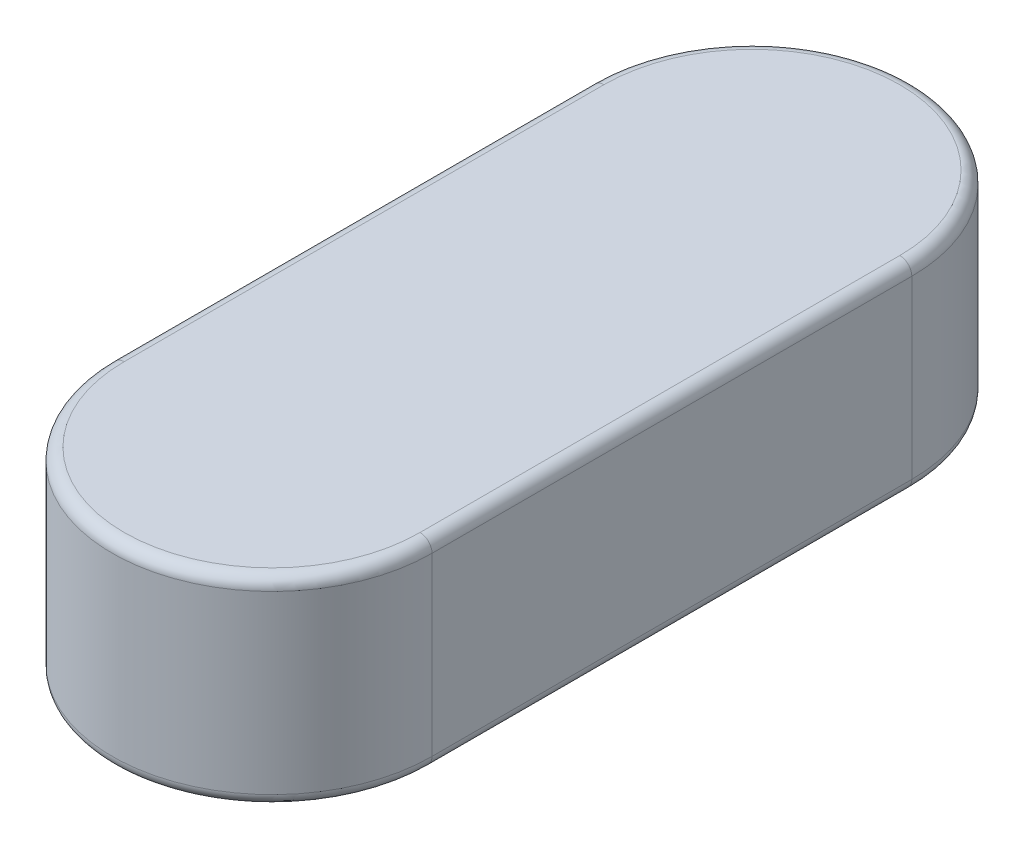
ISO-10303-21;
HEADER;
FILE_DESCRIPTION(('STEP AP214'),'2;1');
FILE_NAME('part.step','',(''),(''),'','','');
FILE_SCHEMA(('AUTOMOTIVE_DESIGN { 1 0 10303 214 1 1 1 1 }'));
ENDSEC;
DATA;
#1=APPLICATION_CONTEXT('core data for automotive mechanical design processes');
#2=APPLICATION_PROTOCOL_DEFINITION('international standard','automotive_design',2000,#1);
#3=PRODUCT_CONTEXT('',#1,'mechanical');
#4=PRODUCT('Part','Part','',(#3));
#5=PRODUCT_RELATED_PRODUCT_CATEGORY('part','',(#4));
#6=PRODUCT_DEFINITION_FORMATION('','',#4);
#7=PRODUCT_DEFINITION_CONTEXT('part definition',#1,'design');
#8=PRODUCT_DEFINITION('design','',#6,#7);
#9=PRODUCT_DEFINITION_SHAPE('','',#8);
#10=(LENGTH_UNIT() NAMED_UNIT(*) SI_UNIT(.MILLI.,.METRE.));
#11=(NAMED_UNIT(*) PLANE_ANGLE_UNIT() SI_UNIT($,.RADIAN.));
#12=(NAMED_UNIT(*) SI_UNIT($,.STERADIAN.) SOLID_ANGLE_UNIT());
#13=UNCERTAINTY_MEASURE_WITH_UNIT(LENGTH_MEASURE(1.E-05),#10,'distance_accuracy_value','');
#14=(GEOMETRIC_REPRESENTATION_CONTEXT(3) GLOBAL_UNCERTAINTY_ASSIGNED_CONTEXT((#13)) GLOBAL_UNIT_ASSIGNED_CONTEXT((#10,
#11,#12)) REPRESENTATION_CONTEXT('',''));
#15=CARTESIAN_POINT('',(0.,0.,0.));
#16=DIRECTION('',(0.,0.,1.));
#17=DIRECTION('',(1.,0.,0.));
#18=AXIS2_PLACEMENT_3D('',#15,#16,#17);
#19=CARTESIAN_POINT('',(0.,10.,0.));
#20=DIRECTION('',(0.,-1.,0.));
#21=DIRECTION('',(0.,0.,-1.));
#22=AXIS2_PLACEMENT_3D('',#19,#20,#21);
#23=CYLINDRICAL_SURFACE('',#22,8.);
#24=DIRECTION('',(0.,-1.,0.));
#25=VECTOR('',#24,1.);
#26=CARTESIAN_POINT('',(-8.,10.,0.));
#27=LINE('',#26,#25);
#28=CARTESIAN_POINT('',(-8.,9.4,0.));
#29=VERTEX_POINT('',#28);
#30=CARTESIAN_POINT('',(-8.,0.6,0.));
#31=VERTEX_POINT('',#30);
#32=EDGE_CURVE('E154',#29,#31,#27,.T.);
#33=ORIENTED_EDGE('',*,*,#32,.T.);
#34=CARTESIAN_POINT('',(0.,0.6,0.));
#35=DIRECTION('',(0.,1.,0.));
#36=DIRECTION('',(0.,0.,1.));
#37=AXIS2_PLACEMENT_3D('',#34,#35,#36);
#38=CIRCLE('',#37,8.);
#39=CARTESIAN_POINT('',(8.,0.6,0.));
#40=VERTEX_POINT('',#39);
#41=EDGE_CURVE('E163',#31,#40,#38,.T.);
#42=ORIENTED_EDGE('',*,*,#41,.T.);
#43=DIRECTION('',(0.,-1.,0.));
#44=VECTOR('',#43,1.);
#45=CARTESIAN_POINT('',(8.,10.,0.));
#46=LINE('',#45,#44);
#47=CARTESIAN_POINT('',(8.,9.4,0.));
#48=VERTEX_POINT('',#47);
#49=EDGE_CURVE('E132',#48,#40,#46,.T.);
#50=ORIENTED_EDGE('',*,*,#49,.F.);
#51=CARTESIAN_POINT('',(0.,9.4,0.));
#52=DIRECTION('',(0.,1.,0.));
#53=DIRECTION('',(0.,0.,1.));
#54=AXIS2_PLACEMENT_3D('',#51,#52,#53);
#55=CIRCLE('',#54,8.);
#56=EDGE_CURVE('E165',#48,#29,#55,.F.);
#57=ORIENTED_EDGE('',*,*,#56,.T.);
#58=EDGE_LOOP('',(#33,#42,#50,#57));
#59=FACE_BOUND('',#58,.T.);
#60=ADVANCED_FACE('F45',(#59),#23,.T.);
#61=CARTESIAN_POINT('',(8.,10.,0.));
#62=DIRECTION('',(-1.,0.,0.));
#63=DIRECTION('',(0.,0.,1.));
#64=AXIS2_PLACEMENT_3D('',#61,#62,#63);
#65=PLANE('',#64);
#66=ORIENTED_EDGE('',*,*,#49,.T.);
#67=DIRECTION('',(0.,0.,-1.));
#68=VECTOR('',#67,1.);
#69=CARTESIAN_POINT('',(8.,0.6,0.));
#70=LINE('',#69,#68);
#71=CARTESIAN_POINT('',(8.,0.6,-24.));
#72=VERTEX_POINT('',#71);
#73=EDGE_CURVE('E131',#40,#72,#70,.T.);
#74=ORIENTED_EDGE('',*,*,#73,.T.);
#75=DIRECTION('',(0.,-1.,0.));
#76=VECTOR('',#75,1.);
#77=CARTESIAN_POINT('',(8.,10.,-24.));
#78=LINE('',#77,#76);
#79=CARTESIAN_POINT('',(8.,9.4,-24.));
#80=VERTEX_POINT('',#79);
#81=EDGE_CURVE('E114',#80,#72,#78,.T.);
#82=ORIENTED_EDGE('',*,*,#81,.F.);
#83=DIRECTION('',(0.,0.,-1.));
#84=VECTOR('',#83,1.);
#85=CARTESIAN_POINT('',(8.,9.4,0.));
#86=LINE('',#85,#84);
#87=EDGE_CURVE('E128',#80,#48,#86,.F.);
#88=ORIENTED_EDGE('',*,*,#87,.T.);
#89=EDGE_LOOP('',(#66,#74,#82,#88));
#90=FACE_BOUND('',#89,.T.);
#91=ADVANCED_FACE('F127',(#90),#65,.F.);
#92=CARTESIAN_POINT('',(0.,10.,-24.));
#93=DIRECTION('',(0.,-1.,0.));
#94=DIRECTION('',(0.,0.,-1.));
#95=AXIS2_PLACEMENT_3D('',#92,#93,#94);
#96=CYLINDRICAL_SURFACE('',#95,8.);
#97=ORIENTED_EDGE('',*,*,#81,.T.);
#98=CARTESIAN_POINT('',(0.,0.6,-24.));
#99=DIRECTION('',(0.,1.,0.));
#100=DIRECTION('',(0.,0.,1.));
#101=AXIS2_PLACEMENT_3D('',#98,#99,#100);
#102=CIRCLE('',#101,8.);
#103=CARTESIAN_POINT('',(-8.,0.6,-24.));
#104=VERTEX_POINT('',#103);
#105=EDGE_CURVE('E120',#72,#104,#102,.T.);
#106=ORIENTED_EDGE('',*,*,#105,.T.);
#107=DIRECTION('',(0.,-1.,0.));
#108=VECTOR('',#107,1.);
#109=CARTESIAN_POINT('',(-8.,10.,-24.));
#110=LINE('',#109,#108);
#111=CARTESIAN_POINT('',(-8.,9.4,-24.));
#112=VERTEX_POINT('',#111);
#113=EDGE_CURVE('E116',#112,#104,#110,.T.);
#114=ORIENTED_EDGE('',*,*,#113,.F.);
#115=CARTESIAN_POINT('',(0.,9.4,-24.));
#116=DIRECTION('',(0.,1.,0.));
#117=DIRECTION('',(0.,0.,1.));
#118=AXIS2_PLACEMENT_3D('',#115,#116,#117);
#119=CIRCLE('',#118,8.);
#120=EDGE_CURVE('E111',#112,#80,#119,.F.);
#121=ORIENTED_EDGE('',*,*,#120,.T.);
#122=EDGE_LOOP('',(#97,#106,#114,#121));
#123=FACE_BOUND('',#122,.T.);
#124=ADVANCED_FACE('F113',(#123),#96,.T.);
#125=CARTESIAN_POINT('',(-8.,10.,0.));
#126=DIRECTION('',(1.,0.,0.));
#127=DIRECTION('',(0.,0.,-1.));
#128=AXIS2_PLACEMENT_3D('',#125,#126,#127);
#129=PLANE('',#128);
#130=ORIENTED_EDGE('',*,*,#113,.T.);
#131=DIRECTION('',(0.,0.,1.));
#132=VECTOR('',#131,1.);
#133=CARTESIAN_POINT('',(-8.,0.6,0.));
#134=LINE('',#133,#132);
#135=EDGE_CURVE('E167',#104,#31,#134,.T.);
#136=ORIENTED_EDGE('',*,*,#135,.T.);
#137=ORIENTED_EDGE('',*,*,#32,.F.);
#138=DIRECTION('',(0.,0.,1.));
#139=VECTOR('',#138,1.);
#140=CARTESIAN_POINT('',(-8.,9.4,-24.));
#141=LINE('',#140,#139);
#142=EDGE_CURVE('E169',#29,#112,#141,.F.);
#143=ORIENTED_EDGE('',*,*,#142,.T.);
#144=EDGE_LOOP('',(#130,#136,#137,#143));
#145=FACE_BOUND('',#144,.T.);
#146=ADVANCED_FACE('F207',(#145),#129,.F.);
#147=CARTESIAN_POINT('',(0.,10.,0.));
#148=DIRECTION('',(0.,1.,0.));
#149=DIRECTION('',(0.,0.,1.));
#150=AXIS2_PLACEMENT_3D('',#147,#148,#149);
#151=PLANE('',#150);
#152=CARTESIAN_POINT('',(0.,10.,-24.));
#153=DIRECTION('',(0.,1.,0.));
#154=DIRECTION('',(0.,0.,1.));
#155=AXIS2_PLACEMENT_3D('',#152,#153,#154);
#156=CIRCLE('',#155,7.4);
#157=CARTESIAN_POINT('',(7.4,10.,-24.));
#158=VERTEX_POINT('',#157);
#159=CARTESIAN_POINT('',(-7.4,10.,-24.));
#160=VERTEX_POINT('',#159);
#161=EDGE_CURVE('E54',#158,#160,#156,.T.);
#162=ORIENTED_EDGE('',*,*,#161,.T.);
#163=DIRECTION('',(0.,0.,1.));
#164=VECTOR('',#163,1.);
#165=CARTESIAN_POINT('',(-7.4,10.,0.));
#166=LINE('',#165,#164);
#167=CARTESIAN_POINT('',(-7.4,10.,0.));
#168=VERTEX_POINT('',#167);
#169=EDGE_CURVE('E11',#160,#168,#166,.T.);
#170=ORIENTED_EDGE('',*,*,#169,.T.);
#171=CARTESIAN_POINT('',(0.,10.,0.));
#172=DIRECTION('',(0.,1.,0.));
#173=DIRECTION('',(0.,0.,1.));
#174=AXIS2_PLACEMENT_3D('',#171,#172,#173);
#175=CIRCLE('',#174,7.4);
#176=CARTESIAN_POINT('',(7.4,10.,0.));
#177=VERTEX_POINT('',#176);
#178=EDGE_CURVE('E161',#168,#177,#175,.T.);
#179=ORIENTED_EDGE('',*,*,#178,.T.);
#180=DIRECTION('',(0.,0.,-1.));
#181=VECTOR('',#180,1.);
#182=CARTESIAN_POINT('',(7.4,10.,-24.));
#183=LINE('',#182,#181);
#184=EDGE_CURVE('E65',#177,#158,#183,.T.);
#185=ORIENTED_EDGE('',*,*,#184,.T.);
#186=EDGE_LOOP('',(#162,#170,#179,#185));
#187=FACE_BOUND('',#186,.T.);
#188=ADVANCED_FACE('F213',(#187),#151,.T.);
#189=CARTESIAN_POINT('',(0.,0.,0.));
#190=DIRECTION('',(0.,1.,0.));
#191=DIRECTION('',(0.,0.,1.));
#192=AXIS2_PLACEMENT_3D('',#189,#190,#191);
#193=PLANE('',#192);
#194=CARTESIAN_POINT('',(0.,0.,-24.));
#195=DIRECTION('',(0.,1.,0.));
#196=DIRECTION('',(0.,0.,1.));
#197=AXIS2_PLACEMENT_3D('',#194,#195,#196);
#198=CIRCLE('',#197,7.4);
#199=CARTESIAN_POINT('',(-7.4,0.,-24.));
#200=VERTEX_POINT('',#199);
#201=CARTESIAN_POINT('',(7.4,0.,-24.));
#202=VERTEX_POINT('',#201);
#203=EDGE_CURVE('E174',#200,#202,#198,.F.);
#204=ORIENTED_EDGE('',*,*,#203,.T.);
#205=DIRECTION('',(0.,0.,-1.));
#206=VECTOR('',#205,1.);
#207=CARTESIAN_POINT('',(7.4,0.,0.));
#208=LINE('',#207,#206);
#209=CARTESIAN_POINT('',(7.4,0.,0.));
#210=VERTEX_POINT('',#209);
#211=EDGE_CURVE('E121',#202,#210,#208,.F.);
#212=ORIENTED_EDGE('',*,*,#211,.T.);
#213=CARTESIAN_POINT('',(0.,0.,0.));
#214=DIRECTION('',(0.,1.,0.));
#215=DIRECTION('',(0.,0.,1.));
#216=AXIS2_PLACEMENT_3D('',#213,#214,#215);
#217=CIRCLE('',#216,7.4);
#218=CARTESIAN_POINT('',(-7.4,0.,0.));
#219=VERTEX_POINT('',#218);
#220=EDGE_CURVE('E178',#210,#219,#217,.F.);
#221=ORIENTED_EDGE('',*,*,#220,.T.);
#222=DIRECTION('',(0.,0.,1.));
#223=VECTOR('',#222,1.);
#224=CARTESIAN_POINT('',(-7.4,0.,0.));
#225=LINE('',#224,#223);
#226=EDGE_CURVE('E176',#219,#200,#225,.F.);
#227=ORIENTED_EDGE('',*,*,#226,.T.);
#228=EDGE_LOOP('',(#204,#212,#221,#227));
#229=FACE_BOUND('',#228,.T.);
#230=ADVANCED_FACE('F215',(#229),#193,.F.);
#231=CARTESIAN_POINT('',(-7.4,0.6,0.));
#232=DIRECTION('',(0.,0.,1.));
#233=DIRECTION('',(1.,0.,0.));
#234=AXIS2_PLACEMENT_3D('',#231,#232,#233);
#235=CYLINDRICAL_SURFACE('',#234,0.6);
#236=CARTESIAN_POINT('',(-7.4,0.6,-24.));
#237=DIRECTION('',(0.,0.,-1.));
#238=DIRECTION('',(-1.,0.,0.));
#239=AXIS2_PLACEMENT_3D('',#236,#237,#238);
#240=CIRCLE('',#239,0.6);
#241=EDGE_CURVE('E155',#200,#104,#240,.T.);
#242=ORIENTED_EDGE('',*,*,#241,.F.);
#243=ORIENTED_EDGE('',*,*,#226,.F.);
#244=CARTESIAN_POINT('',(-7.4,0.6,0.));
#245=DIRECTION('',(0.,0.,1.));
#246=DIRECTION('',(1.,0.,0.));
#247=AXIS2_PLACEMENT_3D('',#244,#245,#246);
#248=CIRCLE('',#247,0.6);
#249=EDGE_CURVE('E151',#31,#219,#248,.T.);
#250=ORIENTED_EDGE('',*,*,#249,.F.);
#251=ORIENTED_EDGE('',*,*,#135,.F.);
#252=EDGE_LOOP('',(#242,#243,#250,#251));
#253=FACE_BOUND('',#252,.T.);
#254=ADVANCED_FACE('F194',(#253),#235,.T.);
#255=CARTESIAN_POINT('',(0.,0.6,0.));
#256=DIRECTION('',(0.,1.,0.));
#257=DIRECTION('',(0.,0.,1.));
#258=AXIS2_PLACEMENT_3D('',#255,#256,#257);
#259=TOROIDAL_SURFACE('',#258,7.4,0.6);
#260=ORIENTED_EDGE('',*,*,#249,.T.);
#261=ORIENTED_EDGE('',*,*,#220,.F.);
#262=CARTESIAN_POINT('',(7.4,0.6,0.));
#263=DIRECTION('',(0.,0.,-1.));
#264=DIRECTION('',(-1.,0.,0.));
#265=AXIS2_PLACEMENT_3D('',#262,#263,#264);
#266=CIRCLE('',#265,0.6);
#267=EDGE_CURVE('E142',#40,#210,#266,.T.);
#268=ORIENTED_EDGE('',*,*,#267,.F.);
#269=ORIENTED_EDGE('',*,*,#41,.F.);
#270=EDGE_LOOP('',(#260,#261,#268,#269));
#271=FACE_BOUND('',#270,.T.);
#272=ADVANCED_FACE('F198',(#271),#259,.T.);
#273=CARTESIAN_POINT('',(0.,0.6,-24.));
#274=DIRECTION('',(0.,1.,0.));
#275=DIRECTION('',(0.,0.,1.));
#276=AXIS2_PLACEMENT_3D('',#273,#274,#275);
#277=TOROIDAL_SURFACE('',#276,7.4,0.6);
#278=ORIENTED_EDGE('',*,*,#241,.T.);
#279=ORIENTED_EDGE('',*,*,#105,.F.);
#280=CARTESIAN_POINT('',(7.4,0.6,-24.));
#281=DIRECTION('',(0.,0.,1.));
#282=DIRECTION('',(1.,0.,0.));
#283=AXIS2_PLACEMENT_3D('',#280,#281,#282);
#284=CIRCLE('',#283,0.6);
#285=EDGE_CURVE('E141',#202,#72,#284,.T.);
#286=ORIENTED_EDGE('',*,*,#285,.F.);
#287=ORIENTED_EDGE('',*,*,#203,.F.);
#288=EDGE_LOOP('',(#278,#279,#286,#287));
#289=FACE_BOUND('',#288,.T.);
#290=ADVANCED_FACE('F206',(#289),#277,.T.);
#291=CARTESIAN_POINT('',(7.4,0.6,0.));
#292=DIRECTION('',(0.,0.,-1.));
#293=DIRECTION('',(-1.,0.,0.));
#294=AXIS2_PLACEMENT_3D('',#291,#292,#293);
#295=CYLINDRICAL_SURFACE('',#294,0.6);
#296=ORIENTED_EDGE('',*,*,#267,.T.);
#297=ORIENTED_EDGE('',*,*,#211,.F.);
#298=ORIENTED_EDGE('',*,*,#285,.T.);
#299=ORIENTED_EDGE('',*,*,#73,.F.);
#300=EDGE_LOOP('',(#296,#297,#298,#299));
#301=FACE_BOUND('',#300,.T.);
#302=ADVANCED_FACE('F201',(#301),#295,.T.);
#303=CARTESIAN_POINT('',(7.4,9.4,0.));
#304=DIRECTION('',(0.,0.,1.));
#305=DIRECTION('',(1.,0.,0.));
#306=AXIS2_PLACEMENT_3D('',#303,#304,#305);
#307=CYLINDRICAL_SURFACE('',#306,0.6);
#308=CARTESIAN_POINT('',(7.4,9.4,0.));
#309=DIRECTION('',(0.,0.,1.));
#310=DIRECTION('',(1.,0.,0.));
#311=AXIS2_PLACEMENT_3D('',#308,#309,#310);
#312=CIRCLE('',#311,0.6);
#313=EDGE_CURVE('E137',#48,#177,#312,.T.);
#314=ORIENTED_EDGE('',*,*,#313,.F.);
#315=ORIENTED_EDGE('',*,*,#87,.F.);
#316=CARTESIAN_POINT('',(7.4,9.4,-24.));
#317=DIRECTION('',(0.,0.,-1.));
#318=DIRECTION('',(-1.,0.,0.));
#319=AXIS2_PLACEMENT_3D('',#316,#317,#318);
#320=CIRCLE('',#319,0.6);
#321=EDGE_CURVE('E49',#158,#80,#320,.T.);
#322=ORIENTED_EDGE('',*,*,#321,.F.);
#323=ORIENTED_EDGE('',*,*,#184,.F.);
#324=EDGE_LOOP('',(#314,#315,#322,#323));
#325=FACE_BOUND('',#324,.T.);
#326=ADVANCED_FACE('F47',(#325),#307,.T.);
#327=CARTESIAN_POINT('',(0.,9.4,-24.));
#328=DIRECTION('',(0.,1.,0.));
#329=DIRECTION('',(0.,0.,1.));
#330=AXIS2_PLACEMENT_3D('',#327,#328,#329);
#331=TOROIDAL_SURFACE('',#330,7.4,0.6);
#332=ORIENTED_EDGE('',*,*,#321,.T.);
#333=ORIENTED_EDGE('',*,*,#120,.F.);
#334=CARTESIAN_POINT('',(-7.4,9.4,-24.));
#335=DIRECTION('',(0.,0.,1.));
#336=DIRECTION('',(1.,0.,0.));
#337=AXIS2_PLACEMENT_3D('',#334,#335,#336);
#338=CIRCLE('',#337,0.6);
#339=EDGE_CURVE('E144',#160,#112,#338,.T.);
#340=ORIENTED_EDGE('',*,*,#339,.F.);
#341=ORIENTED_EDGE('',*,*,#161,.F.);
#342=EDGE_LOOP('',(#332,#333,#340,#341));
#343=FACE_BOUND('',#342,.T.);
#344=ADVANCED_FACE('F140',(#343),#331,.T.);
#345=CARTESIAN_POINT('',(0.,9.4,0.));
#346=DIRECTION('',(0.,1.,0.));
#347=DIRECTION('',(0.,0.,1.));
#348=AXIS2_PLACEMENT_3D('',#345,#346,#347);
#349=TOROIDAL_SURFACE('',#348,7.4,0.6);
#350=ORIENTED_EDGE('',*,*,#313,.T.);
#351=ORIENTED_EDGE('',*,*,#178,.F.);
#352=CARTESIAN_POINT('',(-7.4,9.4,0.));
#353=DIRECTION('',(0.,0.,-1.));
#354=DIRECTION('',(-1.,0.,0.));
#355=AXIS2_PLACEMENT_3D('',#352,#353,#354);
#356=CIRCLE('',#355,0.6);
#357=EDGE_CURVE('E147',#29,#168,#356,.T.);
#358=ORIENTED_EDGE('',*,*,#357,.F.);
#359=ORIENTED_EDGE('',*,*,#56,.F.);
#360=EDGE_LOOP('',(#350,#351,#358,#359));
#361=FACE_BOUND('',#360,.T.);
#362=ADVANCED_FACE('F212',(#361),#349,.T.);
#363=CARTESIAN_POINT('',(-7.4,9.4,0.));
#364=DIRECTION('',(0.,0.,-1.));
#365=DIRECTION('',(-1.,0.,0.));
#366=AXIS2_PLACEMENT_3D('',#363,#364,#365);
#367=CYLINDRICAL_SURFACE('',#366,0.6);
#368=ORIENTED_EDGE('',*,*,#339,.T.);
#369=ORIENTED_EDGE('',*,*,#142,.F.);
#370=ORIENTED_EDGE('',*,*,#357,.T.);
#371=ORIENTED_EDGE('',*,*,#169,.F.);
#372=EDGE_LOOP('',(#368,#369,#370,#371));
#373=FACE_BOUND('',#372,.T.);
#374=ADVANCED_FACE('F210',(#373),#367,.T.);
#375=CLOSED_SHELL('',(#60,#91,#124,#146,#188,#230,#254,#272,#290,#302,#326,#344,#362,#374));
#376=MANIFOLD_SOLID_BREP('B2',#375);
#377=ADVANCED_BREP_SHAPE_REPRESENTATION('',(#18,#376),#14);
#378=SHAPE_DEFINITION_REPRESENTATION(#9,#377);
ENDSEC;
END-ISO-10303-21;
